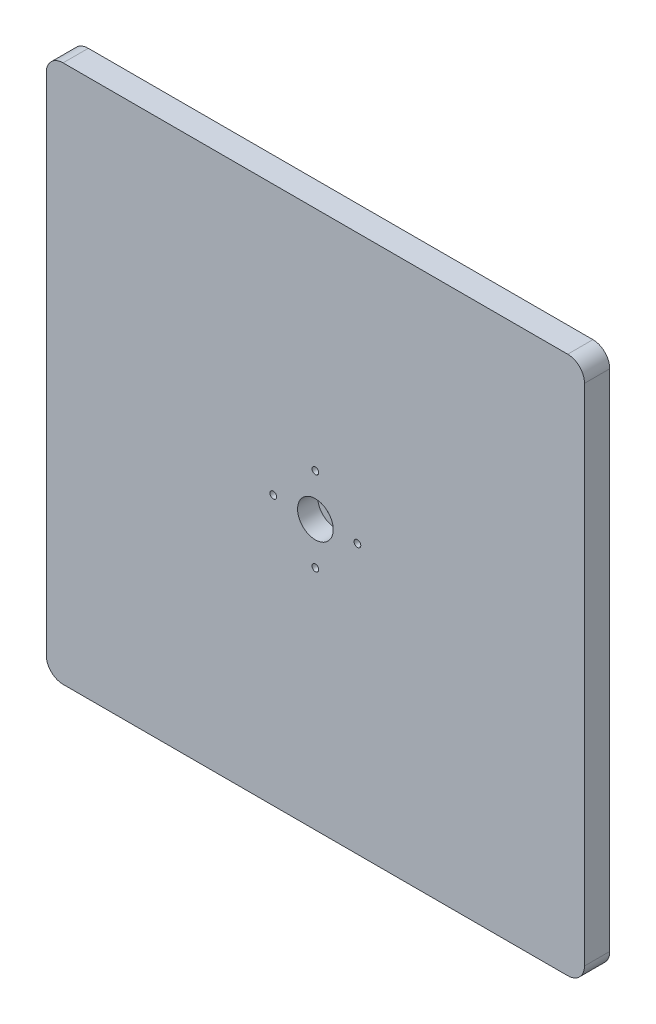
ISO-10303-21;
HEADER;
FILE_DESCRIPTION(('STEP AP214'),'2;1');
FILE_NAME('part.step','',(''),(''),'','','');
FILE_SCHEMA(('AUTOMOTIVE_DESIGN { 1 0 10303 214 1 1 1 1 }'));
ENDSEC;
DATA;
#1=APPLICATION_CONTEXT('core data for automotive mechanical design processes');
#2=APPLICATION_PROTOCOL_DEFINITION('international standard','automotive_design',2000,#1);
#3=PRODUCT_CONTEXT('',#1,'mechanical');
#4=PRODUCT('Part','Part','',(#3));
#5=PRODUCT_RELATED_PRODUCT_CATEGORY('part','',(#4));
#6=PRODUCT_DEFINITION_FORMATION('','',#4);
#7=PRODUCT_DEFINITION_CONTEXT('part definition',#1,'design');
#8=PRODUCT_DEFINITION('design','',#6,#7);
#9=PRODUCT_DEFINITION_SHAPE('','',#8);
#10=(LENGTH_UNIT() NAMED_UNIT(*) SI_UNIT(.MILLI.,.METRE.));
#11=(NAMED_UNIT(*) PLANE_ANGLE_UNIT() SI_UNIT($,.RADIAN.));
#12=(NAMED_UNIT(*) SI_UNIT($,.STERADIAN.) SOLID_ANGLE_UNIT());
#13=UNCERTAINTY_MEASURE_WITH_UNIT(LENGTH_MEASURE(1.E-05),#10,'distance_accuracy_value','');
#14=(GEOMETRIC_REPRESENTATION_CONTEXT(3) GLOBAL_UNCERTAINTY_ASSIGNED_CONTEXT((#13)) GLOBAL_UNIT_ASSIGNED_CONTEXT((#10,
#11,#12)) REPRESENTATION_CONTEXT('',''));
#15=CARTESIAN_POINT('',(0.,0.,0.));
#16=DIRECTION('',(0.,0.,1.));
#17=DIRECTION('',(1.,0.,0.));
#18=AXIS2_PLACEMENT_3D('',#15,#16,#17);
#19=CARTESIAN_POINT('',(-150.,-150.,15.));
#20=DIRECTION('',(0.,0.,-1.));
#21=DIRECTION('',(-1.,0.,0.));
#22=AXIS2_PLACEMENT_3D('',#19,#20,#21);
#23=CYLINDRICAL_SURFACE('',#22,10.);
#24=CARTESIAN_POINT('',(-150.,-150.,0.));
#25=DIRECTION('',(0.,0.,1.));
#26=DIRECTION('',(1.,0.,0.));
#27=AXIS2_PLACEMENT_3D('',#24,#25,#26);
#28=CIRCLE('',#27,10.);
#29=CARTESIAN_POINT('',(-160.,-150.,0.));
#30=VERTEX_POINT('',#29);
#31=CARTESIAN_POINT('',(-150.,-160.,0.));
#32=VERTEX_POINT('',#31);
#33=EDGE_CURVE('E135',#30,#32,#28,.T.);
#34=ORIENTED_EDGE('',*,*,#33,.T.);
#35=DIRECTION('',(0.,0.,-1.));
#36=VECTOR('',#35,1.);
#37=CARTESIAN_POINT('',(-150.,-160.,15.));
#38=LINE('',#37,#36);
#39=CARTESIAN_POINT('',(-150.,-160.,15.));
#40=VERTEX_POINT('',#39);
#41=EDGE_CURVE('E11',#40,#32,#38,.T.);
#42=ORIENTED_EDGE('',*,*,#41,.F.);
#43=CARTESIAN_POINT('',(-150.,-150.,15.));
#44=DIRECTION('',(0.,0.,1.));
#45=DIRECTION('',(1.,0.,0.));
#46=AXIS2_PLACEMENT_3D('',#43,#44,#45);
#47=CIRCLE('',#46,10.);
#48=CARTESIAN_POINT('',(-160.,-150.,15.));
#49=VERTEX_POINT('',#48);
#50=EDGE_CURVE('E150',#49,#40,#47,.T.);
#51=ORIENTED_EDGE('',*,*,#50,.F.);
#52=DIRECTION('',(0.,0.,-1.));
#53=VECTOR('',#52,1.);
#54=CARTESIAN_POINT('',(-160.,-150.,15.));
#55=LINE('',#54,#53);
#56=EDGE_CURVE('E131',#49,#30,#55,.T.);
#57=ORIENTED_EDGE('',*,*,#56,.T.);
#58=EDGE_LOOP('',(#34,#42,#51,#57));
#59=FACE_BOUND('',#58,.T.);
#60=ADVANCED_FACE('F38',(#59),#23,.T.);
#61=CARTESIAN_POINT('',(-150.,-160.,15.));
#62=DIRECTION('',(0.,1.,0.));
#63=DIRECTION('',(0.,0.,1.));
#64=AXIS2_PLACEMENT_3D('',#61,#62,#63);
#65=PLANE('',#64);
#66=DIRECTION('',(1.,0.,0.));
#67=VECTOR('',#66,1.);
#68=CARTESIAN_POINT('',(-150.,-160.,0.));
#69=LINE('',#68,#67);
#70=CARTESIAN_POINT('',(150.,-160.,0.));
#71=VERTEX_POINT('',#70);
#72=EDGE_CURVE('E138',#32,#71,#69,.T.);
#73=ORIENTED_EDGE('',*,*,#72,.T.);
#74=DIRECTION('',(0.,0.,-1.));
#75=VECTOR('',#74,1.);
#76=CARTESIAN_POINT('',(150.,-160.,15.));
#77=LINE('',#76,#75);
#78=CARTESIAN_POINT('',(150.,-160.,15.));
#79=VERTEX_POINT('',#78);
#80=EDGE_CURVE('E47',#79,#71,#77,.T.);
#81=ORIENTED_EDGE('',*,*,#80,.F.);
#82=DIRECTION('',(1.,0.,0.));
#83=VECTOR('',#82,1.);
#84=CARTESIAN_POINT('',(-150.,-160.,15.));
#85=LINE('',#84,#83);
#86=EDGE_CURVE('E98',#40,#79,#85,.T.);
#87=ORIENTED_EDGE('',*,*,#86,.F.);
#88=ORIENTED_EDGE('',*,*,#41,.T.);
#89=EDGE_LOOP('',(#73,#81,#87,#88));
#90=FACE_BOUND('',#89,.T.);
#91=ADVANCED_FACE('F253',(#90),#65,.F.);
#92=CARTESIAN_POINT('',(150.,-150.,15.));
#93=DIRECTION('',(0.,0.,-1.));
#94=DIRECTION('',(-1.,0.,0.));
#95=AXIS2_PLACEMENT_3D('',#92,#93,#94);
#96=CYLINDRICAL_SURFACE('',#95,10.);
#97=CARTESIAN_POINT('',(150.,-150.,0.));
#98=DIRECTION('',(0.,0.,1.));
#99=DIRECTION('',(1.,0.,0.));
#100=AXIS2_PLACEMENT_3D('',#97,#98,#99);
#101=CIRCLE('',#100,10.);
#102=CARTESIAN_POINT('',(160.,-150.,0.));
#103=VERTEX_POINT('',#102);
#104=EDGE_CURVE('E141',#71,#103,#101,.T.);
#105=ORIENTED_EDGE('',*,*,#104,.T.);
#106=DIRECTION('',(0.,0.,-1.));
#107=VECTOR('',#106,1.);
#108=CARTESIAN_POINT('',(160.,-150.,15.));
#109=LINE('',#108,#107);
#110=CARTESIAN_POINT('',(160.,-150.,15.));
#111=VERTEX_POINT('',#110);
#112=EDGE_CURVE('E157',#111,#103,#109,.T.);
#113=ORIENTED_EDGE('',*,*,#112,.F.);
#114=CARTESIAN_POINT('',(150.,-150.,15.));
#115=DIRECTION('',(0.,0.,1.));
#116=DIRECTION('',(1.,0.,0.));
#117=AXIS2_PLACEMENT_3D('',#114,#115,#116);
#118=CIRCLE('',#117,10.);
#119=EDGE_CURVE('E166',#79,#111,#118,.T.);
#120=ORIENTED_EDGE('',*,*,#119,.F.);
#121=ORIENTED_EDGE('',*,*,#80,.T.);
#122=EDGE_LOOP('',(#105,#113,#120,#121));
#123=FACE_BOUND('',#122,.T.);
#124=ADVANCED_FACE('F164',(#123),#96,.T.);
#125=CARTESIAN_POINT('',(160.,150.,15.));
#126=DIRECTION('',(-1.,0.,0.));
#127=DIRECTION('',(0.,-1.,0.));
#128=AXIS2_PLACEMENT_3D('',#125,#126,#127);
#129=PLANE('',#128);
#130=DIRECTION('',(0.,1.,0.));
#131=VECTOR('',#130,1.);
#132=CARTESIAN_POINT('',(160.,150.,0.));
#133=LINE('',#132,#131);
#134=CARTESIAN_POINT('',(160.,150.,0.));
#135=VERTEX_POINT('',#134);
#136=EDGE_CURVE('E143',#103,#135,#133,.T.);
#137=ORIENTED_EDGE('',*,*,#136,.T.);
#138=DIRECTION('',(0.,0.,-1.));
#139=VECTOR('',#138,1.);
#140=CARTESIAN_POINT('',(160.,150.,15.));
#141=LINE('',#140,#139);
#142=CARTESIAN_POINT('',(160.,150.,15.));
#143=VERTEX_POINT('',#142);
#144=EDGE_CURVE('E154',#143,#135,#141,.T.);
#145=ORIENTED_EDGE('',*,*,#144,.F.);
#146=DIRECTION('',(0.,1.,0.));
#147=VECTOR('',#146,1.);
#148=CARTESIAN_POINT('',(160.,150.,15.));
#149=LINE('',#148,#147);
#150=EDGE_CURVE('E178',#111,#143,#149,.T.);
#151=ORIENTED_EDGE('',*,*,#150,.F.);
#152=ORIENTED_EDGE('',*,*,#112,.T.);
#153=EDGE_LOOP('',(#137,#145,#151,#152));
#154=FACE_BOUND('',#153,.T.);
#155=ADVANCED_FACE('F174',(#154),#129,.F.);
#156=CARTESIAN_POINT('',(150.,150.,15.));
#157=DIRECTION('',(0.,0.,-1.));
#158=DIRECTION('',(-1.,0.,0.));
#159=AXIS2_PLACEMENT_3D('',#156,#157,#158);
#160=CYLINDRICAL_SURFACE('',#159,10.);
#161=CARTESIAN_POINT('',(150.,150.,0.));
#162=DIRECTION('',(0.,0.,1.));
#163=DIRECTION('',(-1.,0.,0.));
#164=AXIS2_PLACEMENT_3D('',#161,#162,#163);
#165=CIRCLE('',#164,10.);
#166=CARTESIAN_POINT('',(150.,160.,0.));
#167=VERTEX_POINT('',#166);
#168=EDGE_CURVE('E145',#135,#167,#165,.T.);
#169=ORIENTED_EDGE('',*,*,#168,.T.);
#170=DIRECTION('',(0.,0.,-1.));
#171=VECTOR('',#170,1.);
#172=CARTESIAN_POINT('',(150.,160.,15.));
#173=LINE('',#172,#171);
#174=CARTESIAN_POINT('',(150.,160.,15.));
#175=VERTEX_POINT('',#174);
#176=EDGE_CURVE('E126',#175,#167,#173,.T.);
#177=ORIENTED_EDGE('',*,*,#176,.F.);
#178=CARTESIAN_POINT('',(150.,150.,15.));
#179=DIRECTION('',(0.,0.,1.));
#180=DIRECTION('',(-1.,0.,0.));
#181=AXIS2_PLACEMENT_3D('',#178,#179,#180);
#182=CIRCLE('',#181,10.);
#183=EDGE_CURVE('E117',#143,#175,#182,.T.);
#184=ORIENTED_EDGE('',*,*,#183,.F.);
#185=ORIENTED_EDGE('',*,*,#144,.T.);
#186=EDGE_LOOP('',(#169,#177,#184,#185));
#187=FACE_BOUND('',#186,.T.);
#188=ADVANCED_FACE('F177',(#187),#160,.T.);
#189=CARTESIAN_POINT('',(-150.,160.,15.));
#190=DIRECTION('',(0.,-1.,0.));
#191=DIRECTION('',(0.,0.,-1.));
#192=AXIS2_PLACEMENT_3D('',#189,#190,#191);
#193=PLANE('',#192);
#194=DIRECTION('',(-1.,0.,0.));
#195=VECTOR('',#194,1.);
#196=CARTESIAN_POINT('',(-150.,160.,0.));
#197=LINE('',#196,#195);
#198=CARTESIAN_POINT('',(-150.,160.,0.));
#199=VERTEX_POINT('',#198);
#200=EDGE_CURVE('E125',#167,#199,#197,.T.);
#201=ORIENTED_EDGE('',*,*,#200,.T.);
#202=DIRECTION('',(0.,0.,-1.));
#203=VECTOR('',#202,1.);
#204=CARTESIAN_POINT('',(-150.,160.,15.));
#205=LINE('',#204,#203);
#206=CARTESIAN_POINT('',(-150.,160.,15.));
#207=VERTEX_POINT('',#206);
#208=EDGE_CURVE('E122',#207,#199,#205,.T.);
#209=ORIENTED_EDGE('',*,*,#208,.F.);
#210=DIRECTION('',(-1.,0.,0.));
#211=VECTOR('',#210,1.);
#212=CARTESIAN_POINT('',(-150.,160.,15.));
#213=LINE('',#212,#211);
#214=EDGE_CURVE('E111',#175,#207,#213,.T.);
#215=ORIENTED_EDGE('',*,*,#214,.F.);
#216=ORIENTED_EDGE('',*,*,#176,.T.);
#217=EDGE_LOOP('',(#201,#209,#215,#216));
#218=FACE_BOUND('',#217,.T.);
#219=ADVANCED_FACE('F123',(#218),#193,.F.);
#220=CARTESIAN_POINT('',(-150.,150.,15.));
#221=DIRECTION('',(0.,0.,-1.));
#222=DIRECTION('',(-1.,0.,0.));
#223=AXIS2_PLACEMENT_3D('',#220,#221,#222);
#224=CYLINDRICAL_SURFACE('',#223,10.);
#225=CARTESIAN_POINT('',(-150.,150.,0.));
#226=DIRECTION('',(0.,0.,1.));
#227=DIRECTION('',(1.,0.,0.));
#228=AXIS2_PLACEMENT_3D('',#225,#226,#227);
#229=CIRCLE('',#228,10.);
#230=CARTESIAN_POINT('',(-160.,150.,0.));
#231=VERTEX_POINT('',#230);
#232=EDGE_CURVE('E84',#199,#231,#229,.T.);
#233=ORIENTED_EDGE('',*,*,#232,.T.);
#234=DIRECTION('',(0.,0.,-1.));
#235=VECTOR('',#234,1.);
#236=CARTESIAN_POINT('',(-160.,150.,15.));
#237=LINE('',#236,#235);
#238=CARTESIAN_POINT('',(-160.,150.,15.));
#239=VERTEX_POINT('',#238);
#240=EDGE_CURVE('E127',#239,#231,#237,.T.);
#241=ORIENTED_EDGE('',*,*,#240,.F.);
#242=CARTESIAN_POINT('',(-150.,150.,15.));
#243=DIRECTION('',(0.,0.,1.));
#244=DIRECTION('',(1.,0.,0.));
#245=AXIS2_PLACEMENT_3D('',#242,#243,#244);
#246=CIRCLE('',#245,10.);
#247=EDGE_CURVE('E115',#207,#239,#246,.T.);
#248=ORIENTED_EDGE('',*,*,#247,.F.);
#249=ORIENTED_EDGE('',*,*,#208,.T.);
#250=EDGE_LOOP('',(#233,#241,#248,#249));
#251=FACE_BOUND('',#250,.T.);
#252=ADVANCED_FACE('F129',(#251),#224,.T.);
#253=CARTESIAN_POINT('',(-160.,150.,15.));
#254=DIRECTION('',(1.,0.,0.));
#255=DIRECTION('',(0.,1.,0.));
#256=AXIS2_PLACEMENT_3D('',#253,#254,#255);
#257=PLANE('',#256);
#258=DIRECTION('',(0.,-1.,0.));
#259=VECTOR('',#258,1.);
#260=CARTESIAN_POINT('',(-160.,150.,0.));
#261=LINE('',#260,#259);
#262=EDGE_CURVE('E90',#231,#30,#261,.T.);
#263=ORIENTED_EDGE('',*,*,#262,.T.);
#264=ORIENTED_EDGE('',*,*,#56,.F.);
#265=DIRECTION('',(0.,-1.,0.));
#266=VECTOR('',#265,1.);
#267=CARTESIAN_POINT('',(-160.,150.,15.));
#268=LINE('',#267,#266);
#269=EDGE_CURVE('E55',#239,#49,#268,.T.);
#270=ORIENTED_EDGE('',*,*,#269,.F.);
#271=ORIENTED_EDGE('',*,*,#240,.T.);
#272=EDGE_LOOP('',(#263,#264,#270,#271));
#273=FACE_BOUND('',#272,.T.);
#274=ADVANCED_FACE('F228',(#273),#257,.F.);
#275=CARTESIAN_POINT('',(-150.,-150.,15.));
#276=DIRECTION('',(0.,0.,1.));
#277=DIRECTION('',(1.,0.,0.));
#278=AXIS2_PLACEMENT_3D('',#275,#276,#277);
#279=PLANE('',#278);
#280=CARTESIAN_POINT('',(0.,25.,15.));
#281=DIRECTION('',(0.,0.,1.));
#282=DIRECTION('',(1.,0.,0.));
#283=AXIS2_PLACEMENT_3D('',#280,#281,#282);
#284=CIRCLE('',#283,2.);
#285=CARTESIAN_POINT('',(2.,25.,15.));
#286=VERTEX_POINT('',#285);
#287=EDGE_CURVE('E211',#286,#286,#284,.T.);
#288=ORIENTED_EDGE('',*,*,#287,.F.);
#289=EDGE_LOOP('',(#288));
#290=FACE_BOUND('',#289,.T.);
#291=CARTESIAN_POINT('',(25.,0.,15.));
#292=DIRECTION('',(0.,0.,1.));
#293=DIRECTION('',(1.,0.,0.));
#294=AXIS2_PLACEMENT_3D('',#291,#292,#293);
#295=CIRCLE('',#294,2.);
#296=CARTESIAN_POINT('',(27.,0.,15.));
#297=VERTEX_POINT('',#296);
#298=EDGE_CURVE('E205',#297,#297,#295,.T.);
#299=ORIENTED_EDGE('',*,*,#298,.F.);
#300=EDGE_LOOP('',(#299));
#301=FACE_BOUND('',#300,.T.);
#302=CARTESIAN_POINT('',(0.,-25.,15.));
#303=DIRECTION('',(0.,0.,1.));
#304=DIRECTION('',(1.,0.,0.));
#305=AXIS2_PLACEMENT_3D('',#302,#303,#304);
#306=CIRCLE('',#305,2.);
#307=CARTESIAN_POINT('',(2.,-25.,15.));
#308=VERTEX_POINT('',#307);
#309=EDGE_CURVE('E199',#308,#308,#306,.T.);
#310=ORIENTED_EDGE('',*,*,#309,.F.);
#311=EDGE_LOOP('',(#310));
#312=FACE_BOUND('',#311,.T.);
#313=CARTESIAN_POINT('',(-25.,0.,15.));
#314=DIRECTION('',(0.,0.,1.));
#315=DIRECTION('',(1.,0.,0.));
#316=AXIS2_PLACEMENT_3D('',#313,#314,#315);
#317=CIRCLE('',#316,2.);
#318=CARTESIAN_POINT('',(-23.,0.,15.));
#319=VERTEX_POINT('',#318);
#320=EDGE_CURVE('E193',#319,#319,#317,.T.);
#321=ORIENTED_EDGE('',*,*,#320,.F.);
#322=EDGE_LOOP('',(#321));
#323=FACE_BOUND('',#322,.T.);
#324=CARTESIAN_POINT('',(0.,0.,15.));
#325=DIRECTION('',(0.,0.,1.));
#326=DIRECTION('',(1.,0.,0.));
#327=AXIS2_PLACEMENT_3D('',#324,#325,#326);
#328=CIRCLE('',#327,10.6);
#329=CARTESIAN_POINT('',(10.6,0.,15.));
#330=VERTEX_POINT('',#329);
#331=EDGE_CURVE('E184',#330,#330,#328,.T.);
#332=ORIENTED_EDGE('',*,*,#331,.F.);
#333=EDGE_LOOP('',(#332));
#334=FACE_BOUND('',#333,.T.);
#335=ORIENTED_EDGE('',*,*,#50,.T.);
#336=ORIENTED_EDGE('',*,*,#86,.T.);
#337=ORIENTED_EDGE('',*,*,#119,.T.);
#338=ORIENTED_EDGE('',*,*,#150,.T.);
#339=ORIENTED_EDGE('',*,*,#183,.T.);
#340=ORIENTED_EDGE('',*,*,#214,.T.);
#341=ORIENTED_EDGE('',*,*,#247,.T.);
#342=ORIENTED_EDGE('',*,*,#269,.T.);
#343=EDGE_LOOP('',(#335,#336,#337,#338,#339,#340,#341,#342));
#344=FACE_BOUND('',#343,.T.);
#345=ADVANCED_FACE('F113',(#290,#301,#312,#323,#334,#344),#279,.T.);
#346=CARTESIAN_POINT('',(-150.,-150.,0.));
#347=DIRECTION('',(0.,0.,1.));
#348=DIRECTION('',(1.,0.,0.));
#349=AXIS2_PLACEMENT_3D('',#346,#347,#348);
#350=PLANE('',#349);
#351=CARTESIAN_POINT('',(0.,25.,0.));
#352=DIRECTION('',(0.,0.,1.));
#353=DIRECTION('',(1.,0.,0.));
#354=AXIS2_PLACEMENT_3D('',#351,#352,#353);
#355=CIRCLE('',#354,2.);
#356=CARTESIAN_POINT('',(2.,25.,0.));
#357=VERTEX_POINT('',#356);
#358=EDGE_CURVE('E192',#357,#357,#355,.T.);
#359=ORIENTED_EDGE('',*,*,#358,.T.);
#360=EDGE_LOOP('',(#359));
#361=FACE_BOUND('',#360,.T.);
#362=CARTESIAN_POINT('',(25.,0.,0.));
#363=DIRECTION('',(0.,0.,1.));
#364=DIRECTION('',(1.,0.,0.));
#365=AXIS2_PLACEMENT_3D('',#362,#363,#364);
#366=CIRCLE('',#365,2.);
#367=CARTESIAN_POINT('',(27.,0.,0.));
#368=VERTEX_POINT('',#367);
#369=EDGE_CURVE('E208',#368,#368,#366,.T.);
#370=ORIENTED_EDGE('',*,*,#369,.T.);
#371=EDGE_LOOP('',(#370));
#372=FACE_BOUND('',#371,.T.);
#373=CARTESIAN_POINT('',(0.,-25.,0.));
#374=DIRECTION('',(0.,0.,1.));
#375=DIRECTION('',(1.,0.,0.));
#376=AXIS2_PLACEMENT_3D('',#373,#374,#375);
#377=CIRCLE('',#376,2.);
#378=CARTESIAN_POINT('',(2.,-25.,0.));
#379=VERTEX_POINT('',#378);
#380=EDGE_CURVE('E202',#379,#379,#377,.T.);
#381=ORIENTED_EDGE('',*,*,#380,.T.);
#382=EDGE_LOOP('',(#381));
#383=FACE_BOUND('',#382,.T.);
#384=CARTESIAN_POINT('',(-25.,0.,0.));
#385=DIRECTION('',(0.,0.,1.));
#386=DIRECTION('',(1.,0.,0.));
#387=AXIS2_PLACEMENT_3D('',#384,#385,#386);
#388=CIRCLE('',#387,2.);
#389=CARTESIAN_POINT('',(-23.,0.,0.));
#390=VERTEX_POINT('',#389);
#391=EDGE_CURVE('E196',#390,#390,#388,.T.);
#392=ORIENTED_EDGE('',*,*,#391,.T.);
#393=EDGE_LOOP('',(#392));
#394=FACE_BOUND('',#393,.T.);
#395=CARTESIAN_POINT('',(0.,0.,0.));
#396=DIRECTION('',(0.,0.,1.));
#397=DIRECTION('',(1.,0.,0.));
#398=AXIS2_PLACEMENT_3D('',#395,#396,#397);
#399=CIRCLE('',#398,6.5);
#400=CARTESIAN_POINT('',(6.5,0.,0.));
#401=VERTEX_POINT('',#400);
#402=EDGE_CURVE('E41',#401,#401,#399,.T.);
#403=ORIENTED_EDGE('',*,*,#402,.T.);
#404=EDGE_LOOP('',(#403));
#405=FACE_BOUND('',#404,.T.);
#406=ORIENTED_EDGE('',*,*,#33,.F.);
#407=ORIENTED_EDGE('',*,*,#262,.F.);
#408=ORIENTED_EDGE('',*,*,#232,.F.);
#409=ORIENTED_EDGE('',*,*,#200,.F.);
#410=ORIENTED_EDGE('',*,*,#168,.F.);
#411=ORIENTED_EDGE('',*,*,#136,.F.);
#412=ORIENTED_EDGE('',*,*,#104,.F.);
#413=ORIENTED_EDGE('',*,*,#72,.F.);
#414=EDGE_LOOP('',(#406,#407,#408,#409,#410,#411,#412,#413));
#415=FACE_BOUND('',#414,.T.);
#416=ADVANCED_FACE('F170',(#361,#372,#383,#394,#405,#415),#350,.F.);
#417=CARTESIAN_POINT('',(0.,0.,3.));
#418=DIRECTION('',(0.,0.,1.));
#419=DIRECTION('',(1.,0.,0.));
#420=AXIS2_PLACEMENT_3D('',#417,#418,#419);
#421=CYLINDRICAL_SURFACE('',#420,10.6);
#422=CARTESIAN_POINT('',(0.,0.,3.));
#423=DIRECTION('',(0.,0.,1.));
#424=DIRECTION('',(1.,0.,0.));
#425=AXIS2_PLACEMENT_3D('',#422,#423,#424);
#426=CIRCLE('',#425,10.6);
#427=CARTESIAN_POINT('',(10.6,0.,3.));
#428=VERTEX_POINT('',#427);
#429=EDGE_CURVE('E139',#428,#428,#426,.T.);
#430=ORIENTED_EDGE('',*,*,#429,.F.);
#431=EDGE_LOOP('',(#430));
#432=FACE_BOUND('',#431,.T.);
#433=ORIENTED_EDGE('',*,*,#331,.T.);
#434=EDGE_LOOP('',(#433));
#435=FACE_BOUND('',#434,.T.);
#436=ADVANCED_FACE('F238',(#432,#435),#421,.F.);
#437=CARTESIAN_POINT('',(0.,0.,3.));
#438=DIRECTION('',(0.,0.,1.));
#439=DIRECTION('',(1.,0.,0.));
#440=AXIS2_PLACEMENT_3D('',#437,#438,#439);
#441=PLANE('',#440);
#442=CARTESIAN_POINT('',(0.,0.,3.));
#443=DIRECTION('',(0.,0.,1.));
#444=DIRECTION('',(1.,0.,0.));
#445=AXIS2_PLACEMENT_3D('',#442,#443,#444);
#446=CIRCLE('',#445,6.5);
#447=CARTESIAN_POINT('',(6.5,0.,3.));
#448=VERTEX_POINT('',#447);
#449=EDGE_CURVE('E189',#448,#448,#446,.T.);
#450=ORIENTED_EDGE('',*,*,#449,.F.);
#451=EDGE_LOOP('',(#450));
#452=FACE_BOUND('',#451,.T.);
#453=ORIENTED_EDGE('',*,*,#429,.T.);
#454=EDGE_LOOP('',(#453));
#455=FACE_BOUND('',#454,.T.);
#456=ADVANCED_FACE('F240',(#452,#455),#441,.T.);
#457=CARTESIAN_POINT('',(0.,0.,-7.));
#458=DIRECTION('',(0.,0.,1.));
#459=DIRECTION('',(1.,0.,0.));
#460=AXIS2_PLACEMENT_3D('',#457,#458,#459);
#461=CYLINDRICAL_SURFACE('',#460,6.5);
#462=ORIENTED_EDGE('',*,*,#449,.T.);
#463=EDGE_LOOP('',(#462));
#464=FACE_BOUND('',#463,.T.);
#465=ORIENTED_EDGE('',*,*,#402,.F.);
#466=EDGE_LOOP('',(#465));
#467=FACE_BOUND('',#466,.T.);
#468=ADVANCED_FACE('F247',(#464,#467),#461,.F.);
#469=CARTESIAN_POINT('',(-25.,0.,0.));
#470=DIRECTION('',(0.,0.,1.));
#471=DIRECTION('',(1.,0.,0.));
#472=AXIS2_PLACEMENT_3D('',#469,#470,#471);
#473=CYLINDRICAL_SURFACE('',#472,2.);
#474=ORIENTED_EDGE('',*,*,#391,.F.);
#475=EDGE_LOOP('',(#474));
#476=FACE_BOUND('',#475,.T.);
#477=ORIENTED_EDGE('',*,*,#320,.T.);
#478=EDGE_LOOP('',(#477));
#479=FACE_BOUND('',#478,.T.);
#480=ADVANCED_FACE('F319',(#476,#479),#473,.F.);
#481=CARTESIAN_POINT('',(0.,-25.,0.));
#482=DIRECTION('',(0.,0.,1.));
#483=DIRECTION('',(1.,0.,0.));
#484=AXIS2_PLACEMENT_3D('',#481,#482,#483);
#485=CYLINDRICAL_SURFACE('',#484,2.);
#486=ORIENTED_EDGE('',*,*,#380,.F.);
#487=EDGE_LOOP('',(#486));
#488=FACE_BOUND('',#487,.T.);
#489=ORIENTED_EDGE('',*,*,#309,.T.);
#490=EDGE_LOOP('',(#489));
#491=FACE_BOUND('',#490,.T.);
#492=ADVANCED_FACE('F339',(#488,#491),#485,.F.);
#493=CARTESIAN_POINT('',(25.,0.,0.));
#494=DIRECTION('',(0.,0.,1.));
#495=DIRECTION('',(1.,0.,0.));
#496=AXIS2_PLACEMENT_3D('',#493,#494,#495);
#497=CYLINDRICAL_SURFACE('',#496,2.);
#498=ORIENTED_EDGE('',*,*,#369,.F.);
#499=EDGE_LOOP('',(#498));
#500=FACE_BOUND('',#499,.T.);
#501=ORIENTED_EDGE('',*,*,#298,.T.);
#502=EDGE_LOOP('',(#501));
#503=FACE_BOUND('',#502,.T.);
#504=ADVANCED_FACE('F222',(#500,#503),#497,.F.);
#505=CARTESIAN_POINT('',(0.,25.,0.));
#506=DIRECTION('',(0.,0.,1.));
#507=DIRECTION('',(1.,0.,0.));
#508=AXIS2_PLACEMENT_3D('',#505,#506,#507);
#509=CYLINDRICAL_SURFACE('',#508,2.);
#510=ORIENTED_EDGE('',*,*,#358,.F.);
#511=EDGE_LOOP('',(#510));
#512=FACE_BOUND('',#511,.T.);
#513=ORIENTED_EDGE('',*,*,#287,.T.);
#514=EDGE_LOOP('',(#513));
#515=FACE_BOUND('',#514,.T.);
#516=ADVANCED_FACE('F219',(#512,#515),#509,.F.);
#517=CLOSED_SHELL('',(#60,#91,#124,#155,#188,#219,#252,#274,#345,#416,#436,#456,#468,#480,#492,
#504,#516));
#518=MANIFOLD_SOLID_BREP('B2',#517);
#519=ADVANCED_BREP_SHAPE_REPRESENTATION('',(#18,#518),#14);
#520=SHAPE_DEFINITION_REPRESENTATION(#9,#519);
ENDSEC;
END-ISO-10303-21;
